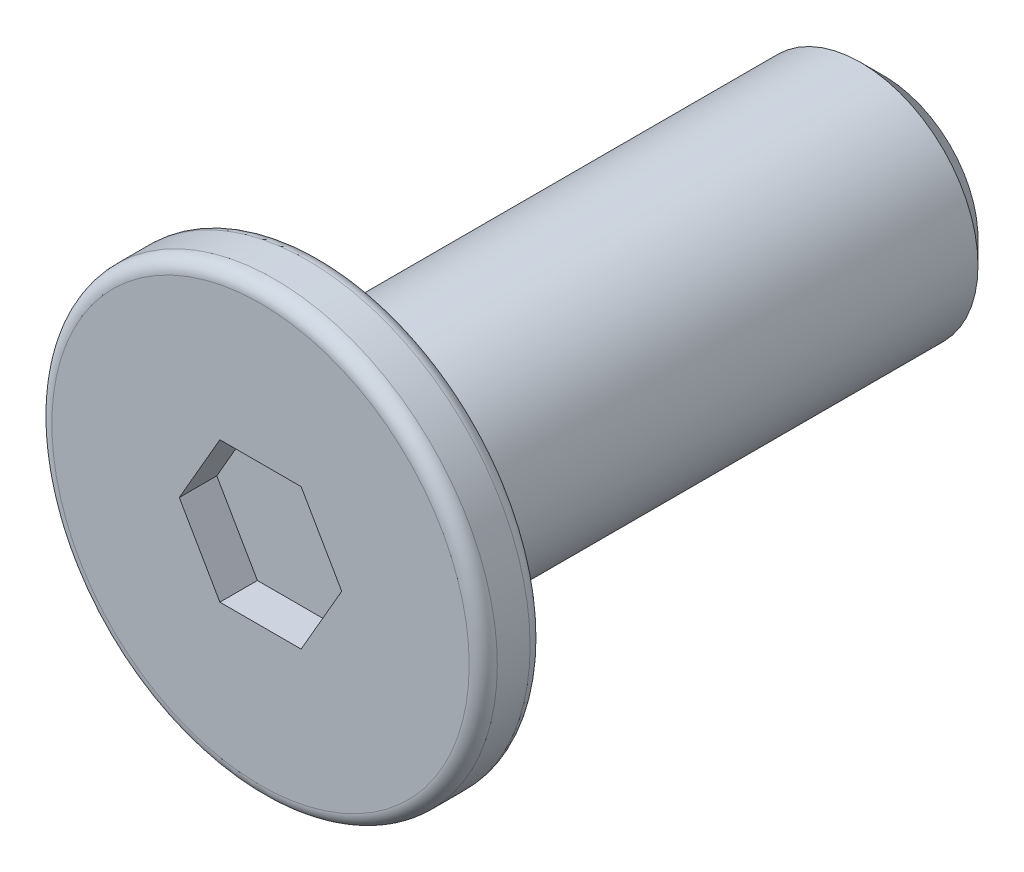
ISO-10303-21;
HEADER;
FILE_DESCRIPTION(('STEP AP214'),'2;1');
FILE_NAME('part.step','',(''),(''),'','','');
FILE_SCHEMA(('AUTOMOTIVE_DESIGN { 1 0 10303 214 1 1 1 1 }'));
ENDSEC;
DATA;
#1=APPLICATION_CONTEXT('core data for automotive mechanical design processes');
#2=APPLICATION_PROTOCOL_DEFINITION('international standard','automotive_design',2000,#1);
#3=PRODUCT_CONTEXT('',#1,'mechanical');
#4=PRODUCT('Part','Part','',(#3));
#5=PRODUCT_RELATED_PRODUCT_CATEGORY('part','',(#4));
#6=PRODUCT_DEFINITION_FORMATION('','',#4);
#7=PRODUCT_DEFINITION_CONTEXT('part definition',#1,'design');
#8=PRODUCT_DEFINITION('design','',#6,#7);
#9=PRODUCT_DEFINITION_SHAPE('','',#8);
#10=(LENGTH_UNIT() NAMED_UNIT(*) SI_UNIT(.MILLI.,.METRE.));
#11=(NAMED_UNIT(*) PLANE_ANGLE_UNIT() SI_UNIT($,.RADIAN.));
#12=(NAMED_UNIT(*) SI_UNIT($,.STERADIAN.) SOLID_ANGLE_UNIT());
#13=UNCERTAINTY_MEASURE_WITH_UNIT(LENGTH_MEASURE(1.E-05),#10,'distance_accuracy_value','');
#14=(GEOMETRIC_REPRESENTATION_CONTEXT(3) GLOBAL_UNCERTAINTY_ASSIGNED_CONTEXT((#13)) GLOBAL_UNIT_ASSIGNED_CONTEXT((#10,
#11,#12)) REPRESENTATION_CONTEXT('',''));
#15=CARTESIAN_POINT('',(0.,0.,0.));
#16=DIRECTION('',(0.,0.,1.));
#17=DIRECTION('',(1.,0.,0.));
#18=AXIS2_PLACEMENT_3D('',#15,#16,#17);
#19=CARTESIAN_POINT('',(0.,0.,0.65));
#20=DIRECTION('',(0.,0.,-1.));
#21=DIRECTION('',(-1.,0.,0.));
#22=AXIS2_PLACEMENT_3D('',#19,#20,#21);
#23=CYLINDRICAL_SURFACE('',#22,4.75);
#24=CARTESIAN_POINT('',(0.,0.,-0.35));
#25=DIRECTION('',(0.,0.,1.));
#26=DIRECTION('',(1.,0.,0.));
#27=AXIS2_PLACEMENT_3D('',#24,#25,#26);
#28=CIRCLE('',#27,4.75);
#29=CARTESIAN_POINT('',(4.75,0.,-0.35));
#30=VERTEX_POINT('',#29);
#31=EDGE_CURVE('E154',#30,#30,#28,.T.);
#32=ORIENTED_EDGE('',*,*,#31,.T.);
#33=EDGE_LOOP('',(#32));
#34=FACE_BOUND('',#33,.T.);
#35=CARTESIAN_POINT('',(0.,0.,0.35));
#36=DIRECTION('',(0.,0.,1.));
#37=DIRECTION('',(1.,0.,0.));
#38=AXIS2_PLACEMENT_3D('',#35,#36,#37);
#39=CIRCLE('',#38,4.75);
#40=CARTESIAN_POINT('',(4.75,0.,0.35));
#41=VERTEX_POINT('',#40);
#42=EDGE_CURVE('E151',#41,#41,#39,.F.);
#43=ORIENTED_EDGE('',*,*,#42,.T.);
#44=EDGE_LOOP('',(#43));
#45=FACE_BOUND('',#44,.T.);
#46=ADVANCED_FACE('F35',(#34,#45),#23,.T.);
#47=CARTESIAN_POINT('',(0.,0.,0.65));
#48=DIRECTION('',(0.,0.,1.));
#49=DIRECTION('',(1.,0.,0.));
#50=AXIS2_PLACEMENT_3D('',#47,#48,#49);
#51=PLANE('',#50);
#52=CARTESIAN_POINT('',(0.,0.,0.65));
#53=DIRECTION('',(0.,0.,1.));
#54=DIRECTION('',(1.,0.,0.));
#55=AXIS2_PLACEMENT_3D('',#52,#53,#54);
#56=CIRCLE('',#55,4.45);
#57=CARTESIAN_POINT('',(4.45,0.,0.65));
#58=VERTEX_POINT('',#57);
#59=EDGE_CURVE('E11',#58,#58,#56,.T.);
#60=ORIENTED_EDGE('',*,*,#59,.T.);
#61=EDGE_LOOP('',(#60));
#62=FACE_BOUND('',#61,.T.);
#63=DIRECTION('',(0.5,0.866025403784439,0.));
#64=VECTOR('',#63,1.);
#65=CARTESIAN_POINT('',(0.86602540378444,-1.5,0.65));
#66=LINE('',#65,#64);
#67=CARTESIAN_POINT('',(0.86602540378444,-1.5,0.65));
#68=VERTEX_POINT('',#67);
#69=CARTESIAN_POINT('',(1.73205080756888,0.,0.65));
#70=VERTEX_POINT('',#69);
#71=EDGE_CURVE('E50',#68,#70,#66,.T.);
#72=ORIENTED_EDGE('',*,*,#71,.F.);
#73=DIRECTION('',(1.,0.,0.));
#74=VECTOR('',#73,1.);
#75=CARTESIAN_POINT('',(-0.866025403784438,-1.5,0.65));
#76=LINE('',#75,#74);
#77=CARTESIAN_POINT('',(-0.866025403784438,-1.5,0.65));
#78=VERTEX_POINT('',#77);
#79=EDGE_CURVE('E133',#78,#68,#76,.T.);
#80=ORIENTED_EDGE('',*,*,#79,.F.);
#81=DIRECTION('',(0.5,-0.866025403784439,0.));
#82=VECTOR('',#81,1.);
#83=CARTESIAN_POINT('',(-1.73205080756888,0.,0.65));
#84=LINE('',#83,#82);
#85=CARTESIAN_POINT('',(-1.73205080756888,0.,0.65));
#86=VERTEX_POINT('',#85);
#87=EDGE_CURVE('E131',#86,#78,#84,.T.);
#88=ORIENTED_EDGE('',*,*,#87,.F.);
#89=DIRECTION('',(-0.5,-0.866025403784439,0.));
#90=VECTOR('',#89,1.);
#91=CARTESIAN_POINT('',(-0.866025403784438,1.5,0.65));
#92=LINE('',#91,#90);
#93=CARTESIAN_POINT('',(-0.866025403784438,1.5,0.65));
#94=VERTEX_POINT('',#93);
#95=EDGE_CURVE('E98',#94,#86,#92,.T.);
#96=ORIENTED_EDGE('',*,*,#95,.F.);
#97=DIRECTION('',(-1.,0.,0.));
#98=VECTOR('',#97,1.);
#99=CARTESIAN_POINT('',(0.866025403784438,1.5,0.65));
#100=LINE('',#99,#98);
#101=CARTESIAN_POINT('',(0.866025403784438,1.5,0.65));
#102=VERTEX_POINT('',#101);
#103=EDGE_CURVE('E127',#102,#94,#100,.T.);
#104=ORIENTED_EDGE('',*,*,#103,.F.);
#105=DIRECTION('',(-0.5,0.866025403784438,0.));
#106=VECTOR('',#105,1.);
#107=CARTESIAN_POINT('',(1.73205080756888,0.,0.65));
#108=LINE('',#107,#106);
#109=EDGE_CURVE('E124',#70,#102,#108,.T.);
#110=ORIENTED_EDGE('',*,*,#109,.F.);
#111=EDGE_LOOP('',(#72,#80,#88,#96,#104,#110));
#112=FACE_BOUND('',#111,.T.);
#113=ADVANCED_FACE('F169',(#62,#112),#51,.T.);
#114=CARTESIAN_POINT('',(0.,0.,-0.65));
#115=DIRECTION('',(0.,0.,1.));
#116=DIRECTION('',(1.,0.,0.));
#117=AXIS2_PLACEMENT_3D('',#114,#115,#116);
#118=PLANE('',#117);
#119=CARTESIAN_POINT('',(0.,0.,-0.65));
#120=DIRECTION('',(0.,0.,1.));
#121=DIRECTION('',(1.,0.,0.));
#122=AXIS2_PLACEMENT_3D('',#119,#120,#121);
#123=CIRCLE('',#122,4.45);
#124=CARTESIAN_POINT('',(4.45,0.,-0.65));
#125=VERTEX_POINT('',#124);
#126=EDGE_CURVE('E43',#125,#125,#123,.F.);
#127=ORIENTED_EDGE('',*,*,#126,.T.);
#128=EDGE_LOOP('',(#127));
#129=FACE_BOUND('',#128,.T.);
#130=CARTESIAN_POINT('',(0.,0.,-0.65));
#131=DIRECTION('',(0.,0.,-1.));
#132=DIRECTION('',(-1.,0.,0.));
#133=AXIS2_PLACEMENT_3D('',#130,#131,#132);
#134=CIRCLE('',#133,2.5);
#135=CARTESIAN_POINT('',(-2.5,0.,-0.65));
#136=VERTEX_POINT('',#135);
#137=EDGE_CURVE('E137',#136,#136,#134,.T.);
#138=ORIENTED_EDGE('',*,*,#137,.F.);
#139=EDGE_LOOP('',(#138));
#140=FACE_BOUND('',#139,.T.);
#141=ADVANCED_FACE('F159',(#129,#140),#118,.F.);
#142=CARTESIAN_POINT('',(0.,0.,-12.65));
#143=DIRECTION('',(0.,0.,1.));
#144=DIRECTION('',(1.,0.,0.));
#145=AXIS2_PLACEMENT_3D('',#142,#143,#144);
#146=CYLINDRICAL_SURFACE('',#145,2.5);
#147=CARTESIAN_POINT('',(0.,0.,-12.15));
#148=DIRECTION('',(0.,0.,-1.));
#149=DIRECTION('',(-1.,0.,0.));
#150=AXIS2_PLACEMENT_3D('',#147,#148,#149);
#151=CIRCLE('',#150,2.5);
#152=CARTESIAN_POINT('',(-2.5,0.,-12.15));
#153=VERTEX_POINT('',#152);
#154=EDGE_CURVE('E148',#153,#153,#151,.F.);
#155=ORIENTED_EDGE('',*,*,#154,.T.);
#156=EDGE_LOOP('',(#155));
#157=FACE_BOUND('',#156,.T.);
#158=ORIENTED_EDGE('',*,*,#137,.T.);
#159=EDGE_LOOP('',(#158));
#160=FACE_BOUND('',#159,.T.);
#161=ADVANCED_FACE('F204',(#157,#160),#146,.T.);
#162=CARTESIAN_POINT('',(0.,0.,-12.65));
#163=DIRECTION('',(0.,0.,-1.));
#164=DIRECTION('',(-1.,0.,0.));
#165=AXIS2_PLACEMENT_3D('',#162,#163,#164);
#166=PLANE('',#165);
#167=CARTESIAN_POINT('',(0.,0.,-12.65));
#168=DIRECTION('',(0.,0.,-1.));
#169=DIRECTION('',(-1.,0.,0.));
#170=AXIS2_PLACEMENT_3D('',#167,#168,#169);
#171=CIRCLE('',#170,1.99999999999999);
#172=CARTESIAN_POINT('',(-1.99999999999999,0.,-12.65));
#173=VERTEX_POINT('',#172);
#174=EDGE_CURVE('E145',#173,#173,#171,.T.);
#175=ORIENTED_EDGE('',*,*,#174,.T.);
#176=EDGE_LOOP('',(#175));
#177=FACE_BOUND('',#176,.T.);
#178=ADVANCED_FACE('F196',(#177),#166,.T.);
#179=CARTESIAN_POINT('',(0.,0.,-12.65));
#180=DIRECTION('',(0.,0.,1.));
#181=DIRECTION('',(1.,0.,0.));
#182=AXIS2_PLACEMENT_3D('',#179,#180,#181);
#183=CONICAL_SURFACE('',#182,1.99999999999999,0.785398163397446);
#184=ORIENTED_EDGE('',*,*,#154,.F.);
#185=EDGE_LOOP('',(#184));
#186=FACE_BOUND('',#185,.T.);
#187=ORIENTED_EDGE('',*,*,#174,.F.);
#188=EDGE_LOOP('',(#187));
#189=FACE_BOUND('',#188,.T.);
#190=ADVANCED_FACE('F189',(#186,#189),#183,.T.);
#191=CARTESIAN_POINT('',(0.86602540378444,-1.5,-0.15));
#192=DIRECTION('',(0.866025403784439,-0.5,0.));
#193=DIRECTION('',(0.5,0.866025403784439,0.));
#194=AXIS2_PLACEMENT_3D('',#191,#192,#193);
#195=PLANE('',#194);
#196=ORIENTED_EDGE('',*,*,#71,.T.);
#197=DIRECTION('',(0.,0.,1.));
#198=VECTOR('',#197,1.);
#199=CARTESIAN_POINT('',(1.73205080756888,0.,-0.15));
#200=LINE('',#199,#198);
#201=CARTESIAN_POINT('',(1.73205080756888,0.,-0.15));
#202=VERTEX_POINT('',#201);
#203=EDGE_CURVE('E80',#202,#70,#200,.T.);
#204=ORIENTED_EDGE('',*,*,#203,.F.);
#205=DIRECTION('',(0.5,0.866025403784439,0.));
#206=VECTOR('',#205,1.);
#207=CARTESIAN_POINT('',(0.86602540378444,-1.5,-0.15));
#208=LINE('',#207,#206);
#209=CARTESIAN_POINT('',(0.86602540378444,-1.5,-0.15));
#210=VERTEX_POINT('',#209);
#211=EDGE_CURVE('E135',#210,#202,#208,.T.);
#212=ORIENTED_EDGE('',*,*,#211,.F.);
#213=DIRECTION('',(0.,0.,1.));
#214=VECTOR('',#213,1.);
#215=CARTESIAN_POINT('',(0.86602540378444,-1.5,-0.15));
#216=LINE('',#215,#214);
#217=EDGE_CURVE('E58',#210,#68,#216,.T.);
#218=ORIENTED_EDGE('',*,*,#217,.T.);
#219=EDGE_LOOP('',(#196,#204,#212,#218));
#220=FACE_BOUND('',#219,.T.);
#221=ADVANCED_FACE('F186',(#220),#195,.F.);
#222=CARTESIAN_POINT('',(-0.866025403784438,-1.5,-0.15));
#223=DIRECTION('',(0.,-1.,0.));
#224=DIRECTION('',(1.,0.,0.));
#225=AXIS2_PLACEMENT_3D('',#222,#223,#224);
#226=PLANE('',#225);
#227=ORIENTED_EDGE('',*,*,#79,.T.);
#228=ORIENTED_EDGE('',*,*,#217,.F.);
#229=DIRECTION('',(1.,0.,0.));
#230=VECTOR('',#229,1.);
#231=CARTESIAN_POINT('',(-0.866025403784438,-1.5,-0.15));
#232=LINE('',#231,#230);
#233=CARTESIAN_POINT('',(-0.866025403784438,-1.5,-0.15));
#234=VERTEX_POINT('',#233);
#235=EDGE_CURVE('E110',#234,#210,#232,.T.);
#236=ORIENTED_EDGE('',*,*,#235,.F.);
#237=DIRECTION('',(0.,0.,1.));
#238=VECTOR('',#237,1.);
#239=CARTESIAN_POINT('',(-0.866025403784438,-1.5,-0.15));
#240=LINE('',#239,#238);
#241=EDGE_CURVE('E102',#234,#78,#240,.T.);
#242=ORIENTED_EDGE('',*,*,#241,.T.);
#243=EDGE_LOOP('',(#227,#228,#236,#242));
#244=FACE_BOUND('',#243,.T.);
#245=ADVANCED_FACE('F188',(#244),#226,.F.);
#246=CARTESIAN_POINT('',(-1.73205080756888,0.,-0.15));
#247=DIRECTION('',(-0.866025403784439,-0.5,0.));
#248=DIRECTION('',(0.5,-0.866025403784439,0.));
#249=AXIS2_PLACEMENT_3D('',#246,#247,#248);
#250=PLANE('',#249);
#251=ORIENTED_EDGE('',*,*,#87,.T.);
#252=ORIENTED_EDGE('',*,*,#241,.F.);
#253=DIRECTION('',(0.5,-0.866025403784439,0.));
#254=VECTOR('',#253,1.);
#255=CARTESIAN_POINT('',(-1.73205080756888,0.,-0.15));
#256=LINE('',#255,#254);
#257=CARTESIAN_POINT('',(-1.73205080756888,0.,-0.15));
#258=VERTEX_POINT('',#257);
#259=EDGE_CURVE('E106',#258,#234,#256,.T.);
#260=ORIENTED_EDGE('',*,*,#259,.F.);
#261=DIRECTION('',(0.,0.,1.));
#262=VECTOR('',#261,1.);
#263=CARTESIAN_POINT('',(-1.73205080756888,0.,-0.15));
#264=LINE('',#263,#262);
#265=EDGE_CURVE('E91',#258,#86,#264,.T.);
#266=ORIENTED_EDGE('',*,*,#265,.T.);
#267=EDGE_LOOP('',(#251,#252,#260,#266));
#268=FACE_BOUND('',#267,.T.);
#269=ADVANCED_FACE('F107',(#268),#250,.F.);
#270=CARTESIAN_POINT('',(-0.866025403784438,1.5,-0.15));
#271=DIRECTION('',(-0.866025403784439,0.5,0.));
#272=DIRECTION('',(-0.5,-0.866025403784439,0.));
#273=AXIS2_PLACEMENT_3D('',#270,#271,#272);
#274=PLANE('',#273);
#275=ORIENTED_EDGE('',*,*,#95,.T.);
#276=ORIENTED_EDGE('',*,*,#265,.F.);
#277=DIRECTION('',(-0.5,-0.866025403784439,0.));
#278=VECTOR('',#277,1.);
#279=CARTESIAN_POINT('',(-0.866025403784438,1.5,-0.15));
#280=LINE('',#279,#278);
#281=CARTESIAN_POINT('',(-0.866025403784438,1.5,-0.15));
#282=VERTEX_POINT('',#281);
#283=EDGE_CURVE('E95',#282,#258,#280,.T.);
#284=ORIENTED_EDGE('',*,*,#283,.F.);
#285=DIRECTION('',(0.,0.,1.));
#286=VECTOR('',#285,1.);
#287=CARTESIAN_POINT('',(-0.866025403784438,1.5,-0.15));
#288=LINE('',#287,#286);
#289=EDGE_CURVE('E103',#282,#94,#288,.T.);
#290=ORIENTED_EDGE('',*,*,#289,.T.);
#291=EDGE_LOOP('',(#275,#276,#284,#290));
#292=FACE_BOUND('',#291,.T.);
#293=ADVANCED_FACE('F93',(#292),#274,.F.);
#294=CARTESIAN_POINT('',(0.866025403784438,1.5,-0.15));
#295=DIRECTION('',(0.,1.,0.));
#296=DIRECTION('',(0.,0.,1.));
#297=AXIS2_PLACEMENT_3D('',#294,#295,#296);
#298=PLANE('',#297);
#299=ORIENTED_EDGE('',*,*,#103,.T.);
#300=ORIENTED_EDGE('',*,*,#289,.F.);
#301=DIRECTION('',(-1.,0.,0.));
#302=VECTOR('',#301,1.);
#303=CARTESIAN_POINT('',(0.866025403784438,1.5,-0.15));
#304=LINE('',#303,#302);
#305=CARTESIAN_POINT('',(0.866025403784438,1.5,-0.15));
#306=VERTEX_POINT('',#305);
#307=EDGE_CURVE('E116',#306,#282,#304,.T.);
#308=ORIENTED_EDGE('',*,*,#307,.F.);
#309=DIRECTION('',(0.,0.,1.));
#310=VECTOR('',#309,1.);
#311=CARTESIAN_POINT('',(0.866025403784438,1.5,-0.15));
#312=LINE('',#311,#310);
#313=EDGE_CURVE('E140',#306,#102,#312,.T.);
#314=ORIENTED_EDGE('',*,*,#313,.T.);
#315=EDGE_LOOP('',(#299,#300,#308,#314));
#316=FACE_BOUND('',#315,.T.);
#317=ADVANCED_FACE('F257',(#316),#298,.F.);
#318=CARTESIAN_POINT('',(1.73205080756888,0.,-0.15));
#319=DIRECTION('',(0.866025403784438,0.5,0.));
#320=DIRECTION('',(-0.5,0.866025403784438,0.));
#321=AXIS2_PLACEMENT_3D('',#318,#319,#320);
#322=PLANE('',#321);
#323=ORIENTED_EDGE('',*,*,#109,.T.);
#324=ORIENTED_EDGE('',*,*,#313,.F.);
#325=DIRECTION('',(-0.5,0.866025403784438,0.));
#326=VECTOR('',#325,1.);
#327=CARTESIAN_POINT('',(1.73205080756888,0.,-0.15));
#328=LINE('',#327,#326);
#329=EDGE_CURVE('E118',#202,#306,#328,.T.);
#330=ORIENTED_EDGE('',*,*,#329,.F.);
#331=ORIENTED_EDGE('',*,*,#203,.T.);
#332=EDGE_LOOP('',(#323,#324,#330,#331));
#333=FACE_BOUND('',#332,.T.);
#334=ADVANCED_FACE('F184',(#333),#322,.F.);
#335=CARTESIAN_POINT('',(0.,0.,-0.15));
#336=DIRECTION('',(0.,0.,1.));
#337=DIRECTION('',(1.,0.,0.));
#338=AXIS2_PLACEMENT_3D('',#335,#336,#337);
#339=PLANE('',#338);
#340=ORIENTED_EDGE('',*,*,#211,.T.);
#341=ORIENTED_EDGE('',*,*,#329,.T.);
#342=ORIENTED_EDGE('',*,*,#307,.T.);
#343=ORIENTED_EDGE('',*,*,#283,.T.);
#344=ORIENTED_EDGE('',*,*,#259,.T.);
#345=ORIENTED_EDGE('',*,*,#235,.T.);
#346=EDGE_LOOP('',(#340,#341,#342,#343,#344,#345));
#347=FACE_BOUND('',#346,.T.);
#348=ADVANCED_FACE('F113',(#347),#339,.T.);
#349=CARTESIAN_POINT('',(0.,0.,-0.35));
#350=DIRECTION('',(0.,0.,1.));
#351=DIRECTION('',(1.,0.,0.));
#352=AXIS2_PLACEMENT_3D('',#349,#350,#351);
#353=TOROIDAL_SURFACE('',#352,4.45,0.3);
#354=ORIENTED_EDGE('',*,*,#126,.F.);
#355=EDGE_LOOP('',(#354));
#356=FACE_BOUND('',#355,.T.);
#357=ORIENTED_EDGE('',*,*,#31,.F.);
#358=EDGE_LOOP('',(#357));
#359=FACE_BOUND('',#358,.T.);
#360=ADVANCED_FACE('F162',(#356,#359),#353,.T.);
#361=CARTESIAN_POINT('',(0.,0.,0.35));
#362=DIRECTION('',(0.,0.,1.));
#363=DIRECTION('',(1.,0.,0.));
#364=AXIS2_PLACEMENT_3D('',#361,#362,#363);
#365=TOROIDAL_SURFACE('',#364,4.45,0.3);
#366=ORIENTED_EDGE('',*,*,#42,.F.);
#367=EDGE_LOOP('',(#366));
#368=FACE_BOUND('',#367,.T.);
#369=ORIENTED_EDGE('',*,*,#59,.F.);
#370=EDGE_LOOP('',(#369));
#371=FACE_BOUND('',#370,.T.);
#372=ADVANCED_FACE('F37',(#368,#371),#365,.T.);
#373=CLOSED_SHELL('',(#46,#113,#141,#161,#178,#190,#221,#245,#269,#293,#317,#334,#348,#360,#372));
#374=MANIFOLD_SOLID_BREP('B2',#373);
#375=ADVANCED_BREP_SHAPE_REPRESENTATION('',(#18,#374),#14);
#376=SHAPE_DEFINITION_REPRESENTATION(#9,#375);
ENDSEC;
END-ISO-10303-21;
